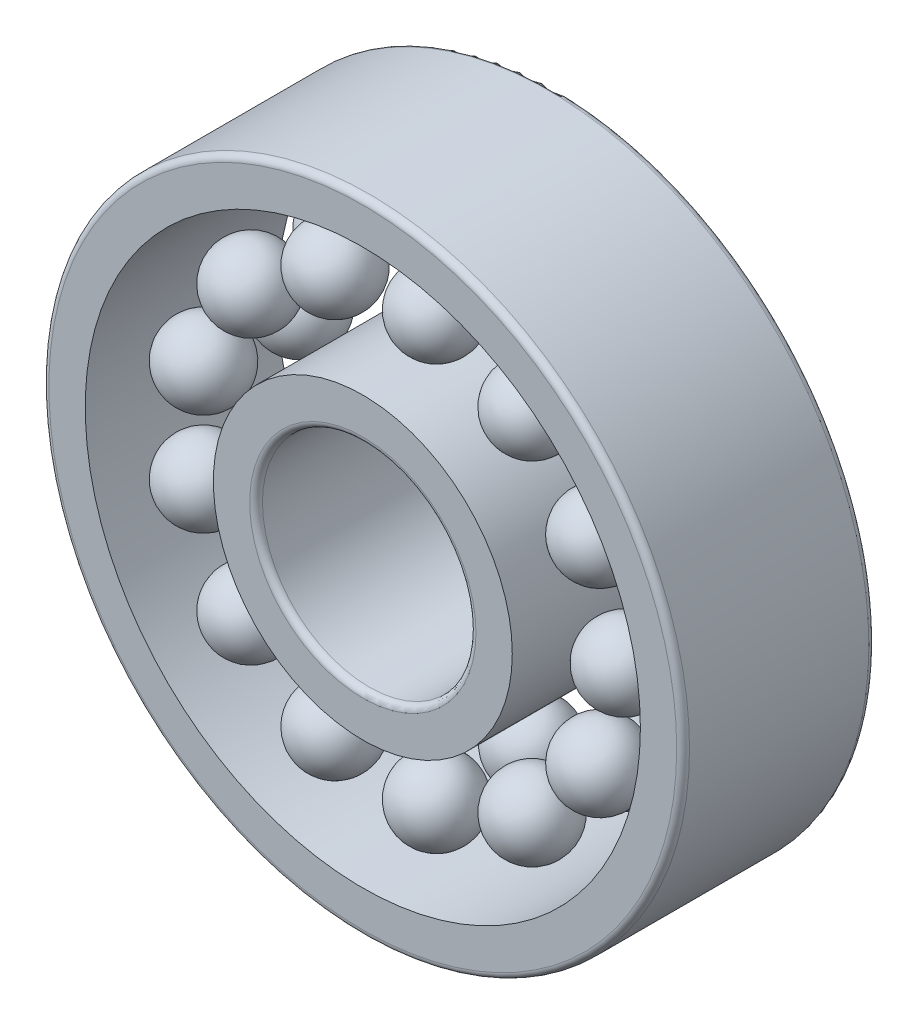
ISO-10303-21;
HEADER;
FILE_DESCRIPTION(('STEP AP214'),'2;1');
FILE_NAME('part.step','',(''),(''),'','','');
FILE_SCHEMA(('AUTOMOTIVE_DESIGN { 1 0 10303 214 1 1 1 1 }'));
ENDSEC;
DATA;
#1=APPLICATION_CONTEXT('core data for automotive mechanical design processes');
#2=APPLICATION_PROTOCOL_DEFINITION('international standard','automotive_design',2000,#1);
#3=PRODUCT_CONTEXT('',#1,'mechanical');
#4=PRODUCT('Part','Part','',(#3));
#5=PRODUCT_RELATED_PRODUCT_CATEGORY('part','',(#4));
#6=PRODUCT_DEFINITION_FORMATION('','',#4);
#7=PRODUCT_DEFINITION_CONTEXT('part definition',#1,'design');
#8=PRODUCT_DEFINITION('design','',#6,#7);
#9=PRODUCT_DEFINITION_SHAPE('','',#8);
#10=(LENGTH_UNIT() NAMED_UNIT(*) SI_UNIT(.MILLI.,.METRE.));
#11=(NAMED_UNIT(*) PLANE_ANGLE_UNIT() SI_UNIT($,.RADIAN.));
#12=(NAMED_UNIT(*) SI_UNIT($,.STERADIAN.) SOLID_ANGLE_UNIT());
#13=UNCERTAINTY_MEASURE_WITH_UNIT(LENGTH_MEASURE(1.E-05),#10,'distance_accuracy_value','');
#14=(GEOMETRIC_REPRESENTATION_CONTEXT(3) GLOBAL_UNCERTAINTY_ASSIGNED_CONTEXT((#13)) GLOBAL_UNIT_ASSIGNED_CONTEXT((#10,
#11,#12)) REPRESENTATION_CONTEXT('',''));
#15=CARTESIAN_POINT('',(0.,0.,0.));
#16=DIRECTION('',(0.,0.,1.));
#17=DIRECTION('',(1.,0.,0.));
#18=AXIS2_PLACEMENT_3D('',#15,#16,#17);
#19=CARTESIAN_POINT('',(8.8545602565321,-4.64723172043769,2.25));
#20=DIRECTION('',(-0.88545602565321,0.464723172043769,0.));
#21=DIRECTION('',(0.,0.,-1.));
#22=AXIS2_PLACEMENT_3D('',#19,#20,#21);
#23=SPHERICAL_SURFACE('',#22,1.8);
#24=CARTESIAN_POINT('',(7.26073941035632,-3.81073001075891,2.25));
#25=VERTEX_POINT('',#24);
#26=VERTEX_LOOP('',#25);
#27=FACE_BOUND('',#26,.T.);
#28=ADVANCED_FACE('F38',(#27),#23,.T.);
#29=CLOSED_SHELL('',(#28));
#30=MANIFOLD_SOLID_BREP('B2',#29);
#31=CARTESIAN_POINT('',(5.68064746731156,-8.22983865893657,2.25));
#32=DIRECTION('',(-0.568064746731156,0.822983865893657,0.));
#33=DIRECTION('',(0.,0.,-1.));
#34=AXIS2_PLACEMENT_3D('',#31,#32,#33);
#35=SPHERICAL_SURFACE('',#34,1.8);
#36=CARTESIAN_POINT('',(4.65813092319548,-6.74846770032798,2.25));
#37=VERTEX_POINT('',#36);
#38=VERTEX_LOOP('',#37);
#39=FACE_BOUND('',#38,.T.);
#40=ADVANCED_FACE('F57',(#39),#35,.T.);
#41=CLOSED_SHELL('',(#40));
#42=MANIFOLD_SOLID_BREP('B6',#41);
#43=CARTESIAN_POINT('',(1.20536680255322,-9.92708874098054,2.25));
#44=DIRECTION('',(-0.120536680255322,0.992708874098054,0.));
#45=DIRECTION('',(0.,0.,-1.));
#46=AXIS2_PLACEMENT_3D('',#43,#44,#45);
#47=SPHERICAL_SURFACE('',#46,1.8);
#48=CARTESIAN_POINT('',(0.988400778093643,-8.14021276760404,2.25));
#49=VERTEX_POINT('',#48);
#50=VERTEX_LOOP('',#49);
#51=FACE_BOUND('',#50,.T.);
#52=ADVANCED_FACE('F76',(#51),#47,.T.);
#53=CLOSED_SHELL('',(#52));
#54=MANIFOLD_SOLID_BREP('B34',#53);
#55=CARTESIAN_POINT('',(-3.54604887042536,-9.35016242685415,2.25));
#56=DIRECTION('',(0.354604887042536,0.935016242685415,0.));
#57=DIRECTION('',(0.,0.,-1.));
#58=AXIS2_PLACEMENT_3D('',#55,#56,#57);
#59=SPHERICAL_SURFACE('',#58,1.8);
#60=CARTESIAN_POINT('',(-2.90776007374879,-7.6671331900204,2.25));
#61=VERTEX_POINT('',#60);
#62=VERTEX_LOOP('',#61);
#63=FACE_BOUND('',#62,.T.);
#64=ADVANCED_FACE('F95',(#63),#59,.T.);
#65=CLOSED_SHELL('',(#64));
#66=MANIFOLD_SOLID_BREP('B53',#65);
#67=CARTESIAN_POINT('',(-7.48510748171101,-6.63122658240795,2.25));
#68=DIRECTION('',(0.748510748171101,0.663122658240795,0.));
#69=DIRECTION('',(0.,0.,-1.));
#70=AXIS2_PLACEMENT_3D('',#67,#68,#69);
#71=SPHERICAL_SURFACE('',#70,1.8);
#72=CARTESIAN_POINT('',(-6.13778813500303,-5.43760579757452,2.25));
#73=VERTEX_POINT('',#72);
#74=VERTEX_LOOP('',#73);
#75=FACE_BOUND('',#74,.T.);
#76=ADVANCED_FACE('F114',(#75),#71,.T.);
#77=CLOSED_SHELL('',(#76));
#78=MANIFOLD_SOLID_BREP('B72',#77);
#79=CARTESIAN_POINT('',(-9.70941817426052,-2.39315664287557,2.25));
#80=DIRECTION('',(0.970941817426052,0.239315664287557,0.));
#81=DIRECTION('',(0.,0.,-1.));
#82=AXIS2_PLACEMENT_3D('',#79,#80,#81);
#83=SPHERICAL_SURFACE('',#82,1.8);
#84=CARTESIAN_POINT('',(-7.96172290289363,-1.96238844715797,2.25));
#85=VERTEX_POINT('',#84);
#86=VERTEX_LOOP('',#85);
#87=FACE_BOUND('',#86,.T.);
#88=ADVANCED_FACE('F133',(#87),#83,.T.);
#89=CLOSED_SHELL('',(#88));
#90=MANIFOLD_SOLID_BREP('B91',#89);
#91=CARTESIAN_POINT('',(-9.70941817426052,2.39315664287558,2.25));
#92=DIRECTION('',(0.970941817426052,-0.239315664287558,0.));
#93=DIRECTION('',(0.,0.,-1.));
#94=AXIS2_PLACEMENT_3D('',#91,#92,#93);
#95=SPHERICAL_SURFACE('',#94,1.8);
#96=CARTESIAN_POINT('',(-7.96172290289363,1.96238844715798,2.25));
#97=VERTEX_POINT('',#96);
#98=VERTEX_LOOP('',#97);
#99=FACE_BOUND('',#98,.T.);
#100=ADVANCED_FACE('F152',(#99),#95,.T.);
#101=CLOSED_SHELL('',(#100));
#102=MANIFOLD_SOLID_BREP('B110',#101);
#103=CARTESIAN_POINT('',(-7.48510748171101,6.63122658240796,2.25));
#104=DIRECTION('',(0.748510748171101,-0.663122658240796,0.));
#105=DIRECTION('',(0.,0.,-1.));
#106=AXIS2_PLACEMENT_3D('',#103,#104,#105);
#107=SPHERICAL_SURFACE('',#106,1.8);
#108=CARTESIAN_POINT('',(-6.13778813500303,5.43760579757452,2.25));
#109=VERTEX_POINT('',#108);
#110=VERTEX_LOOP('',#109);
#111=FACE_BOUND('',#110,.T.);
#112=ADVANCED_FACE('F171',(#111),#107,.T.);
#113=CLOSED_SHELL('',(#112));
#114=MANIFOLD_SOLID_BREP('B129',#113);
#115=CARTESIAN_POINT('',(-3.54604887042536,9.35016242685415,2.25));
#116=DIRECTION('',(0.354604887042536,-0.935016242685415,0.));
#117=DIRECTION('',(0.,0.,-1.));
#118=AXIS2_PLACEMENT_3D('',#115,#116,#117);
#119=SPHERICAL_SURFACE('',#118,1.8);
#120=CARTESIAN_POINT('',(-2.90776007374879,7.6671331900204,2.25));
#121=VERTEX_POINT('',#120);
#122=VERTEX_LOOP('',#121);
#123=FACE_BOUND('',#122,.T.);
#124=ADVANCED_FACE('F190',(#123),#119,.T.);
#125=CLOSED_SHELL('',(#124));
#126=MANIFOLD_SOLID_BREP('B148',#125);
#127=CARTESIAN_POINT('',(1.20536680255323,9.92708874098054,2.25));
#128=DIRECTION('',(-0.120536680255323,-0.992708874098054,0.));
#129=DIRECTION('',(0.,0.,-1.));
#130=AXIS2_PLACEMENT_3D('',#127,#128,#129);
#131=SPHERICAL_SURFACE('',#130,1.8);
#132=CARTESIAN_POINT('',(0.98840077809365,8.14021276760404,2.25));
#133=VERTEX_POINT('',#132);
#134=VERTEX_LOOP('',#133);
#135=FACE_BOUND('',#134,.T.);
#136=ADVANCED_FACE('F209',(#135),#131,.T.);
#137=CLOSED_SHELL('',(#136));
#138=MANIFOLD_SOLID_BREP('B167',#137);
#139=CARTESIAN_POINT('',(5.68064746731156,8.22983865893656,2.25));
#140=DIRECTION('',(-0.568064746731156,-0.822983865893656,0.));
#141=DIRECTION('',(0.,0.,-1.));
#142=AXIS2_PLACEMENT_3D('',#139,#140,#141);
#143=SPHERICAL_SURFACE('',#142,1.8);
#144=CARTESIAN_POINT('',(4.65813092319548,6.74846770032798,2.25));
#145=VERTEX_POINT('',#144);
#146=VERTEX_LOOP('',#145);
#147=FACE_BOUND('',#146,.T.);
#148=ADVANCED_FACE('F228',(#147),#143,.T.);
#149=CLOSED_SHELL('',(#148));
#150=MANIFOLD_SOLID_BREP('B186',#149);
#151=CARTESIAN_POINT('',(8.8545602565321,4.64723172043769,2.25));
#152=DIRECTION('',(-0.88545602565321,-0.464723172043769,0.));
#153=DIRECTION('',(0.,0.,-1.));
#154=AXIS2_PLACEMENT_3D('',#151,#152,#153);
#155=SPHERICAL_SURFACE('',#154,1.8);
#156=CARTESIAN_POINT('',(7.26073941035632,3.8107300107589,2.25));
#157=VERTEX_POINT('',#156);
#158=VERTEX_LOOP('',#157);
#159=FACE_BOUND('',#158,.T.);
#160=ADVANCED_FACE('F247',(#159),#155,.T.);
#161=CLOSED_SHELL('',(#160));
#162=MANIFOLD_SOLID_BREP('B205',#161);
#163=CARTESIAN_POINT('',(10.,0.,2.25));
#164=DIRECTION('',(-1.,0.,0.));
#165=DIRECTION('',(0.,0.,-1.));
#166=AXIS2_PLACEMENT_3D('',#163,#164,#165);
#167=SPHERICAL_SURFACE('',#166,1.8);
#168=CARTESIAN_POINT('',(8.2,0.,2.25));
#169=VERTEX_POINT('',#168);
#170=VERTEX_LOOP('',#169);
#171=FACE_BOUND('',#170,.T.);
#172=ADVANCED_FACE('F266',(#171),#167,.T.);
#173=CLOSED_SHELL('',(#172));
#174=MANIFOLD_SOLID_BREP('B224',#173);
#175=CARTESIAN_POINT('',(8.8545602565321,-4.64723172043769,-2.25));
#176=DIRECTION('',(-0.88545602565321,0.464723172043769,0.));
#177=DIRECTION('',(0.,0.,-1.));
#178=AXIS2_PLACEMENT_3D('',#175,#176,#177);
#179=SPHERICAL_SURFACE('',#178,1.8);
#180=CARTESIAN_POINT('',(7.26073941035632,-3.81073001075891,-2.25));
#181=VERTEX_POINT('',#180);
#182=VERTEX_LOOP('',#181);
#183=FACE_BOUND('',#182,.T.);
#184=ADVANCED_FACE('F285',(#183),#179,.T.);
#185=CLOSED_SHELL('',(#184));
#186=MANIFOLD_SOLID_BREP('B243',#185);
#187=CARTESIAN_POINT('',(5.68064746731156,-8.22983865893657,-2.25));
#188=DIRECTION('',(-0.568064746731156,0.822983865893657,0.));
#189=DIRECTION('',(0.,0.,-1.));
#190=AXIS2_PLACEMENT_3D('',#187,#188,#189);
#191=SPHERICAL_SURFACE('',#190,1.8);
#192=CARTESIAN_POINT('',(4.65813092319548,-6.74846770032798,-2.25));
#193=VERTEX_POINT('',#192);
#194=VERTEX_LOOP('',#193);
#195=FACE_BOUND('',#194,.T.);
#196=ADVANCED_FACE('F304',(#195),#191,.T.);
#197=CLOSED_SHELL('',(#196));
#198=MANIFOLD_SOLID_BREP('B262',#197);
#199=CARTESIAN_POINT('',(1.20536680255322,-9.92708874098054,-2.25));
#200=DIRECTION('',(-0.120536680255322,0.992708874098054,0.));
#201=DIRECTION('',(0.,0.,-1.));
#202=AXIS2_PLACEMENT_3D('',#199,#200,#201);
#203=SPHERICAL_SURFACE('',#202,1.8);
#204=CARTESIAN_POINT('',(0.988400778093643,-8.14021276760404,-2.25));
#205=VERTEX_POINT('',#204);
#206=VERTEX_LOOP('',#205);
#207=FACE_BOUND('',#206,.T.);
#208=ADVANCED_FACE('F323',(#207),#203,.T.);
#209=CLOSED_SHELL('',(#208));
#210=MANIFOLD_SOLID_BREP('B281',#209);
#211=CARTESIAN_POINT('',(-3.54604887042536,-9.35016242685415,-2.25));
#212=DIRECTION('',(0.354604887042536,0.935016242685415,0.));
#213=DIRECTION('',(0.,0.,-1.));
#214=AXIS2_PLACEMENT_3D('',#211,#212,#213);
#215=SPHERICAL_SURFACE('',#214,1.8);
#216=CARTESIAN_POINT('',(-2.90776007374879,-7.6671331900204,-2.25));
#217=VERTEX_POINT('',#216);
#218=VERTEX_LOOP('',#217);
#219=FACE_BOUND('',#218,.T.);
#220=ADVANCED_FACE('F342',(#219),#215,.T.);
#221=CLOSED_SHELL('',(#220));
#222=MANIFOLD_SOLID_BREP('B300',#221);
#223=CARTESIAN_POINT('',(-7.48510748171101,-6.63122658240795,-2.25));
#224=DIRECTION('',(0.748510748171101,0.663122658240795,0.));
#225=DIRECTION('',(0.,0.,-1.));
#226=AXIS2_PLACEMENT_3D('',#223,#224,#225);
#227=SPHERICAL_SURFACE('',#226,1.8);
#228=CARTESIAN_POINT('',(-6.13778813500303,-5.43760579757452,-2.25));
#229=VERTEX_POINT('',#228);
#230=VERTEX_LOOP('',#229);
#231=FACE_BOUND('',#230,.T.);
#232=ADVANCED_FACE('F361',(#231),#227,.T.);
#233=CLOSED_SHELL('',(#232));
#234=MANIFOLD_SOLID_BREP('B319',#233);
#235=CARTESIAN_POINT('',(-9.70941817426052,-2.39315664287557,-2.25));
#236=DIRECTION('',(0.970941817426052,0.239315664287557,0.));
#237=DIRECTION('',(0.,0.,-1.));
#238=AXIS2_PLACEMENT_3D('',#235,#236,#237);
#239=SPHERICAL_SURFACE('',#238,1.8);
#240=CARTESIAN_POINT('',(-7.96172290289363,-1.96238844715797,-2.25));
#241=VERTEX_POINT('',#240);
#242=VERTEX_LOOP('',#241);
#243=FACE_BOUND('',#242,.T.);
#244=ADVANCED_FACE('F380',(#243),#239,.T.);
#245=CLOSED_SHELL('',(#244));
#246=MANIFOLD_SOLID_BREP('B338',#245);
#247=CARTESIAN_POINT('',(-9.70941817426052,2.39315664287558,-2.25));
#248=DIRECTION('',(0.970941817426052,-0.239315664287558,0.));
#249=DIRECTION('',(0.,0.,-1.));
#250=AXIS2_PLACEMENT_3D('',#247,#248,#249);
#251=SPHERICAL_SURFACE('',#250,1.8);
#252=CARTESIAN_POINT('',(-7.96172290289363,1.96238844715798,-2.25));
#253=VERTEX_POINT('',#252);
#254=VERTEX_LOOP('',#253);
#255=FACE_BOUND('',#254,.T.);
#256=ADVANCED_FACE('F399',(#255),#251,.T.);
#257=CLOSED_SHELL('',(#256));
#258=MANIFOLD_SOLID_BREP('B357',#257);
#259=CARTESIAN_POINT('',(-7.48510748171101,6.63122658240796,-2.25));
#260=DIRECTION('',(0.748510748171101,-0.663122658240796,0.));
#261=DIRECTION('',(0.,0.,-1.));
#262=AXIS2_PLACEMENT_3D('',#259,#260,#261);
#263=SPHERICAL_SURFACE('',#262,1.8);
#264=CARTESIAN_POINT('',(-6.13778813500303,5.43760579757452,-2.25));
#265=VERTEX_POINT('',#264);
#266=VERTEX_LOOP('',#265);
#267=FACE_BOUND('',#266,.T.);
#268=ADVANCED_FACE('F418',(#267),#263,.T.);
#269=CLOSED_SHELL('',(#268));
#270=MANIFOLD_SOLID_BREP('B376',#269);
#271=CARTESIAN_POINT('',(-3.54604887042536,9.35016242685415,-2.25));
#272=DIRECTION('',(0.354604887042536,-0.935016242685415,0.));
#273=DIRECTION('',(0.,0.,-1.));
#274=AXIS2_PLACEMENT_3D('',#271,#272,#273);
#275=SPHERICAL_SURFACE('',#274,1.8);
#276=CARTESIAN_POINT('',(-2.90776007374879,7.6671331900204,-2.25));
#277=VERTEX_POINT('',#276);
#278=VERTEX_LOOP('',#277);
#279=FACE_BOUND('',#278,.T.);
#280=ADVANCED_FACE('F437',(#279),#275,.T.);
#281=CLOSED_SHELL('',(#280));
#282=MANIFOLD_SOLID_BREP('B395',#281);
#283=CARTESIAN_POINT('',(1.20536680255323,9.92708874098054,-2.25));
#284=DIRECTION('',(-0.120536680255323,-0.992708874098054,0.));
#285=DIRECTION('',(0.,0.,-1.));
#286=AXIS2_PLACEMENT_3D('',#283,#284,#285);
#287=SPHERICAL_SURFACE('',#286,1.8);
#288=CARTESIAN_POINT('',(0.98840077809365,8.14021276760404,-2.25));
#289=VERTEX_POINT('',#288);
#290=VERTEX_LOOP('',#289);
#291=FACE_BOUND('',#290,.T.);
#292=ADVANCED_FACE('F456',(#291),#287,.T.);
#293=CLOSED_SHELL('',(#292));
#294=MANIFOLD_SOLID_BREP('B414',#293);
#295=CARTESIAN_POINT('',(5.68064746731156,8.22983865893656,-2.25));
#296=DIRECTION('',(-0.568064746731156,-0.822983865893656,0.));
#297=DIRECTION('',(0.,0.,-1.));
#298=AXIS2_PLACEMENT_3D('',#295,#296,#297);
#299=SPHERICAL_SURFACE('',#298,1.8);
#300=CARTESIAN_POINT('',(4.65813092319548,6.74846770032798,-2.25));
#301=VERTEX_POINT('',#300);
#302=VERTEX_LOOP('',#301);
#303=FACE_BOUND('',#302,.T.);
#304=ADVANCED_FACE('F475',(#303),#299,.T.);
#305=CLOSED_SHELL('',(#304));
#306=MANIFOLD_SOLID_BREP('B433',#305);
#307=CARTESIAN_POINT('',(8.8545602565321,4.64723172043769,-2.25));
#308=DIRECTION('',(-0.88545602565321,-0.464723172043769,0.));
#309=DIRECTION('',(0.,0.,-1.));
#310=AXIS2_PLACEMENT_3D('',#307,#308,#309);
#311=SPHERICAL_SURFACE('',#310,1.8);
#312=CARTESIAN_POINT('',(7.26073941035632,3.8107300107589,-2.25));
#313=VERTEX_POINT('',#312);
#314=VERTEX_LOOP('',#313);
#315=FACE_BOUND('',#314,.T.);
#316=ADVANCED_FACE('F494',(#315),#311,.T.);
#317=CLOSED_SHELL('',(#316));
#318=MANIFOLD_SOLID_BREP('B452',#317);
#319=CARTESIAN_POINT('',(10.,0.,-2.25));
#320=DIRECTION('',(-1.,0.,0.));
#321=DIRECTION('',(0.,0.,-1.));
#322=AXIS2_PLACEMENT_3D('',#319,#320,#321);
#323=SPHERICAL_SURFACE('',#322,1.8);
#324=CARTESIAN_POINT('',(8.2,0.,-2.25));
#325=VERTEX_POINT('',#324);
#326=VERTEX_LOOP('',#325);
#327=FACE_BOUND('',#326,.T.);
#328=ADVANCED_FACE('F515',(#327),#323,.T.);
#329=CLOSED_SHELL('',(#328));
#330=MANIFOLD_SOLID_BREP('B471',#329);
#331=CARTESIAN_POINT('',(0.,0.,7.75));
#332=DIRECTION('',(0.,0.,1.));
#333=DIRECTION('',(1.,0.,0.));
#334=AXIS2_PLACEMENT_3D('',#331,#332,#333);
#335=CYLINDRICAL_SURFACE('',#334,13.);
#336=CARTESIAN_POINT('',(0.,0.,4.5));
#337=DIRECTION('',(0.,0.,1.));
#338=DIRECTION('',(1.,0.,0.));
#339=AXIS2_PLACEMENT_3D('',#336,#337,#338);
#340=CIRCLE('',#339,13.);
#341=CARTESIAN_POINT('',(13.,0.,4.5));
#342=VERTEX_POINT('',#341);
#343=EDGE_CURVE('E555',#342,#342,#340,.T.);
#344=ORIENTED_EDGE('',*,*,#343,.T.);
#345=EDGE_LOOP('',(#344));
#346=FACE_BOUND('',#345,.T.);
#347=CARTESIAN_POINT('',(0.,0.,-4.5));
#348=DIRECTION('',(0.,0.,1.));
#349=DIRECTION('',(1.,0.,0.));
#350=AXIS2_PLACEMENT_3D('',#347,#348,#349);
#351=CIRCLE('',#350,13.);
#352=CARTESIAN_POINT('',(13.,0.,-4.5));
#353=VERTEX_POINT('',#352);
#354=EDGE_CURVE('E558',#353,#353,#351,.T.);
#355=ORIENTED_EDGE('',*,*,#354,.F.);
#356=EDGE_LOOP('',(#355));
#357=FACE_BOUND('',#356,.T.);
#358=ADVANCED_FACE('F535',(#346,#357),#335,.F.);
#359=CARTESIAN_POINT('',(13.,0.,4.5));
#360=DIRECTION('',(0.,0.,1.));
#361=DIRECTION('',(1.,0.,0.));
#362=AXIS2_PLACEMENT_3D('',#359,#360,#361);
#363=PLANE('',#362);
#364=CARTESIAN_POINT('',(0.,0.,4.5));
#365=DIRECTION('',(0.,0.,1.));
#366=DIRECTION('',(1.,0.,0.));
#367=AXIS2_PLACEMENT_3D('',#364,#365,#366);
#368=CIRCLE('',#367,14.7);
#369=CARTESIAN_POINT('',(14.7,0.,4.5));
#370=VERTEX_POINT('',#369);
#371=EDGE_CURVE('E514',#370,#370,#368,.T.);
#372=ORIENTED_EDGE('',*,*,#371,.T.);
#373=EDGE_LOOP('',(#372));
#374=FACE_BOUND('',#373,.T.);
#375=ORIENTED_EDGE('',*,*,#343,.F.);
#376=EDGE_LOOP('',(#375));
#377=FACE_BOUND('',#376,.T.);
#378=ADVANCED_FACE('F565',(#374,#377),#363,.T.);
#379=CARTESIAN_POINT('',(0.,0.,7.75));
#380=DIRECTION('',(0.,0.,1.));
#381=DIRECTION('',(1.,0.,0.));
#382=AXIS2_PLACEMENT_3D('',#379,#380,#381);
#383=CYLINDRICAL_SURFACE('',#382,15.);
#384=CARTESIAN_POINT('',(0.,0.,-4.2));
#385=DIRECTION('',(0.,0.,-1.));
#386=DIRECTION('',(-1.,0.,0.));
#387=AXIS2_PLACEMENT_3D('',#384,#385,#386);
#388=CIRCLE('',#387,15.);
#389=CARTESIAN_POINT('',(-15.,0.,-4.2));
#390=VERTEX_POINT('',#389);
#391=EDGE_CURVE('E546',#390,#390,#388,.F.);
#392=ORIENTED_EDGE('',*,*,#391,.T.);
#393=EDGE_LOOP('',(#392));
#394=FACE_BOUND('',#393,.T.);
#395=CARTESIAN_POINT('',(0.,0.,4.2));
#396=DIRECTION('',(0.,0.,1.));
#397=DIRECTION('',(1.,0.,0.));
#398=AXIS2_PLACEMENT_3D('',#395,#396,#397);
#399=CIRCLE('',#398,15.);
#400=CARTESIAN_POINT('',(15.,0.,4.2));
#401=VERTEX_POINT('',#400);
#402=EDGE_CURVE('E550',#401,#401,#399,.F.);
#403=ORIENTED_EDGE('',*,*,#402,.T.);
#404=EDGE_LOOP('',(#403));
#405=FACE_BOUND('',#404,.T.);
#406=ADVANCED_FACE('F571',(#394,#405),#383,.T.);
#407=CARTESIAN_POINT('',(15.,0.,-4.5));
#408=DIRECTION('',(0.,0.,-1.));
#409=DIRECTION('',(-1.,0.,0.));
#410=AXIS2_PLACEMENT_3D('',#407,#408,#409);
#411=PLANE('',#410);
#412=CARTESIAN_POINT('',(0.,0.,-4.5));
#413=DIRECTION('',(0.,0.,-1.));
#414=DIRECTION('',(-1.,0.,0.));
#415=AXIS2_PLACEMENT_3D('',#412,#413,#414);
#416=CIRCLE('',#415,14.7);
#417=CARTESIAN_POINT('',(-14.7,0.,-4.5));
#418=VERTEX_POINT('',#417);
#419=EDGE_CURVE('E542',#418,#418,#416,.T.);
#420=ORIENTED_EDGE('',*,*,#419,.T.);
#421=EDGE_LOOP('',(#420));
#422=FACE_BOUND('',#421,.T.);
#423=ORIENTED_EDGE('',*,*,#354,.T.);
#424=EDGE_LOOP('',(#423));
#425=FACE_BOUND('',#424,.T.);
#426=ADVANCED_FACE('F562',(#422,#425),#411,.T.);
#427=CARTESIAN_POINT('',(0.,0.,-4.2));
#428=DIRECTION('',(0.,0.,-1.));
#429=DIRECTION('',(-1.,0.,0.));
#430=AXIS2_PLACEMENT_3D('',#427,#428,#429);
#431=TOROIDAL_SURFACE('',#430,14.7,0.3);
#432=ORIENTED_EDGE('',*,*,#419,.F.);
#433=EDGE_LOOP('',(#432));
#434=FACE_BOUND('',#433,.T.);
#435=ORIENTED_EDGE('',*,*,#391,.F.);
#436=EDGE_LOOP('',(#435));
#437=FACE_BOUND('',#436,.T.);
#438=ADVANCED_FACE('F574',(#434,#437),#431,.T.);
#439=CARTESIAN_POINT('',(0.,0.,4.2));
#440=DIRECTION('',(0.,0.,1.));
#441=DIRECTION('',(1.,0.,0.));
#442=AXIS2_PLACEMENT_3D('',#439,#440,#441);
#443=TOROIDAL_SURFACE('',#442,14.7,0.3);
#444=ORIENTED_EDGE('',*,*,#402,.F.);
#445=EDGE_LOOP('',(#444));
#446=FACE_BOUND('',#445,.T.);
#447=ORIENTED_EDGE('',*,*,#371,.F.);
#448=EDGE_LOOP('',(#447));
#449=FACE_BOUND('',#448,.T.);
#450=ADVANCED_FACE('F537',(#446,#449),#443,.T.);
#451=CLOSED_SHELL('',(#358,#378,#406,#426,#438,#450));
#452=MANIFOLD_SOLID_BREP('B490',#451);
#453=CARTESIAN_POINT('',(0.,0.,7.75));
#454=DIRECTION('',(0.,0.,1.));
#455=DIRECTION('',(1.,0.,0.));
#456=AXIS2_PLACEMENT_3D('',#453,#454,#455);
#457=CYLINDRICAL_SURFACE('',#456,5.);
#458=CARTESIAN_POINT('',(0.,0.,-4.2));
#459=DIRECTION('',(0.,0.,-1.));
#460=DIRECTION('',(-1.,0.,0.));
#461=AXIS2_PLACEMENT_3D('',#458,#459,#460);
#462=CIRCLE('',#461,5.);
#463=CARTESIAN_POINT('',(-5.,0.,-4.2));
#464=VERTEX_POINT('',#463);
#465=EDGE_CURVE('E634',#464,#464,#462,.T.);
#466=ORIENTED_EDGE('',*,*,#465,.T.);
#467=EDGE_LOOP('',(#466));
#468=FACE_BOUND('',#467,.T.);
#469=CARTESIAN_POINT('',(0.,0.,4.2));
#470=DIRECTION('',(0.,0.,1.));
#471=DIRECTION('',(1.,0.,0.));
#472=AXIS2_PLACEMENT_3D('',#469,#470,#471);
#473=CIRCLE('',#472,5.);
#474=CARTESIAN_POINT('',(5.,0.,4.2));
#475=VERTEX_POINT('',#474);
#476=EDGE_CURVE('E638',#475,#475,#473,.T.);
#477=ORIENTED_EDGE('',*,*,#476,.T.);
#478=EDGE_LOOP('',(#477));
#479=FACE_BOUND('',#478,.T.);
#480=ADVANCED_FACE('F627',(#468,#479),#457,.F.);
#481=CARTESIAN_POINT('',(5.,0.,4.5));
#482=DIRECTION('',(0.,0.,1.));
#483=DIRECTION('',(1.,0.,0.));
#484=AXIS2_PLACEMENT_3D('',#481,#482,#483);
#485=PLANE('',#484);
#486=CARTESIAN_POINT('',(0.,0.,4.5));
#487=DIRECTION('',(0.,0.,1.));
#488=DIRECTION('',(1.,0.,0.));
#489=AXIS2_PLACEMENT_3D('',#486,#487,#488);
#490=CIRCLE('',#489,5.3);
#491=CARTESIAN_POINT('',(5.3,0.,4.5));
#492=VERTEX_POINT('',#491);
#493=EDGE_CURVE('E534',#492,#492,#490,.F.);
#494=ORIENTED_EDGE('',*,*,#493,.T.);
#495=EDGE_LOOP('',(#494));
#496=FACE_BOUND('',#495,.T.);
#497=CARTESIAN_POINT('',(0.,0.,4.5));
#498=DIRECTION('',(0.,0.,1.));
#499=DIRECTION('',(1.,0.,0.));
#500=AXIS2_PLACEMENT_3D('',#497,#498,#499);
#501=CIRCLE('',#500,7.);
#502=CARTESIAN_POINT('',(7.,0.,4.5));
#503=VERTEX_POINT('',#502);
#504=EDGE_CURVE('E647',#503,#503,#501,.T.);
#505=ORIENTED_EDGE('',*,*,#504,.T.);
#506=EDGE_LOOP('',(#505));
#507=FACE_BOUND('',#506,.T.);
#508=ADVANCED_FACE('F667',(#496,#507),#485,.T.);
#509=CARTESIAN_POINT('',(0.,0.,7.75));
#510=DIRECTION('',(0.,0.,1.));
#511=DIRECTION('',(1.,0.,0.));
#512=AXIS2_PLACEMENT_3D('',#509,#510,#511);
#513=CYLINDRICAL_SURFACE('',#512,7.);
#514=CARTESIAN_POINT('',(0.,0.,-4.5));
#515=DIRECTION('',(0.,0.,1.));
#516=DIRECTION('',(1.,0.,0.));
#517=AXIS2_PLACEMENT_3D('',#514,#515,#516);
#518=CIRCLE('',#517,7.);
#519=CARTESIAN_POINT('',(7.,0.,-4.5));
#520=VERTEX_POINT('',#519);
#521=EDGE_CURVE('E650',#520,#520,#518,.T.);
#522=ORIENTED_EDGE('',*,*,#521,.T.);
#523=EDGE_LOOP('',(#522));
#524=FACE_BOUND('',#523,.T.);
#525=ORIENTED_EDGE('',*,*,#504,.F.);
#526=EDGE_LOOP('',(#525));
#527=FACE_BOUND('',#526,.T.);
#528=ADVANCED_FACE('F654',(#524,#527),#513,.T.);
#529=CARTESIAN_POINT('',(7.,0.,-4.5));
#530=DIRECTION('',(0.,0.,-1.));
#531=DIRECTION('',(-1.,0.,0.));
#532=AXIS2_PLACEMENT_3D('',#529,#530,#531);
#533=PLANE('',#532);
#534=CARTESIAN_POINT('',(0.,0.,-4.5));
#535=DIRECTION('',(0.,0.,-1.));
#536=DIRECTION('',(-1.,0.,0.));
#537=AXIS2_PLACEMENT_3D('',#534,#535,#536);
#538=CIRCLE('',#537,5.3);
#539=CARTESIAN_POINT('',(-5.3,0.,-4.5));
#540=VERTEX_POINT('',#539);
#541=EDGE_CURVE('E642',#540,#540,#538,.F.);
#542=ORIENTED_EDGE('',*,*,#541,.T.);
#543=EDGE_LOOP('',(#542));
#544=FACE_BOUND('',#543,.T.);
#545=ORIENTED_EDGE('',*,*,#521,.F.);
#546=EDGE_LOOP('',(#545));
#547=FACE_BOUND('',#546,.T.);
#548=ADVANCED_FACE('F657',(#544,#547),#533,.T.);
#549=CARTESIAN_POINT('',(0.,0.,-4.2));
#550=DIRECTION('',(0.,0.,-1.));
#551=DIRECTION('',(-1.,0.,0.));
#552=AXIS2_PLACEMENT_3D('',#549,#550,#551);
#553=TOROIDAL_SURFACE('',#552,5.3,0.3);
#554=ORIENTED_EDGE('',*,*,#465,.F.);
#555=EDGE_LOOP('',(#554));
#556=FACE_BOUND('',#555,.T.);
#557=ORIENTED_EDGE('',*,*,#541,.F.);
#558=EDGE_LOOP('',(#557));
#559=FACE_BOUND('',#558,.T.);
#560=ADVANCED_FACE('F659',(#556,#559),#553,.T.);
#561=CARTESIAN_POINT('',(0.,0.,4.2));
#562=DIRECTION('',(0.,0.,1.));
#563=DIRECTION('',(1.,0.,0.));
#564=AXIS2_PLACEMENT_3D('',#561,#562,#563);
#565=TOROIDAL_SURFACE('',#564,5.3,0.3);
#566=ORIENTED_EDGE('',*,*,#493,.F.);
#567=EDGE_LOOP('',(#566));
#568=FACE_BOUND('',#567,.T.);
#569=ORIENTED_EDGE('',*,*,#476,.F.);
#570=EDGE_LOOP('',(#569));
#571=FACE_BOUND('',#570,.T.);
#572=ADVANCED_FACE('F629',(#568,#571),#565,.T.);
#573=CLOSED_SHELL('',(#480,#508,#528,#548,#560,#572));
#574=MANIFOLD_SOLID_BREP('B509',#573);
#575=ADVANCED_BREP_SHAPE_REPRESENTATION('',(#18,#30,#42,#54,#66,#78,#90,#102,#114,#126,#138,
#150,#162,#174,#186,#198,#210,#222,#234,#246,#258,#270,#282,#294,#306,#318,#330,#452,#574),#14);
#576=SHAPE_DEFINITION_REPRESENTATION(#9,#575);
ENDSEC;
END-ISO-10303-21;
